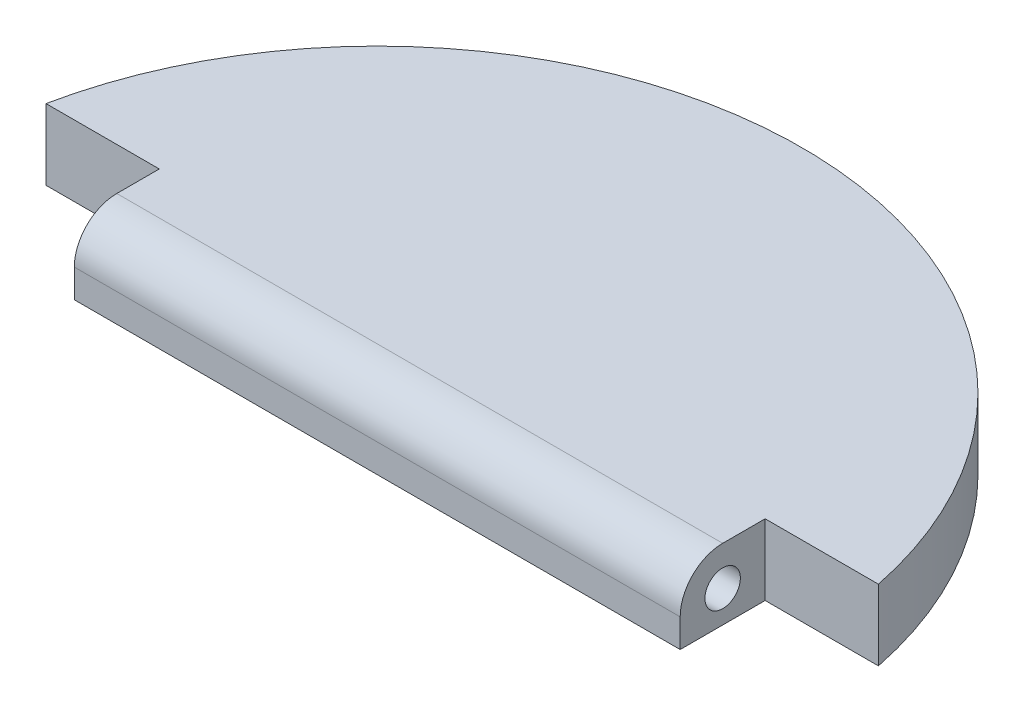
ISO-10303-21;
HEADER;
FILE_DESCRIPTION(('STEP AP214'),'2;1');
FILE_NAME('part.step','',(''),(''),'','','');
FILE_SCHEMA(('AUTOMOTIVE_DESIGN { 1 0 10303 214 1 1 1 1 }'));
ENDSEC;
DATA;
#1=APPLICATION_CONTEXT('core data for automotive mechanical design processes');
#2=APPLICATION_PROTOCOL_DEFINITION('international standard','automotive_design',2000,#1);
#3=PRODUCT_CONTEXT('',#1,'mechanical');
#4=PRODUCT('Part','Part','',(#3));
#5=PRODUCT_RELATED_PRODUCT_CATEGORY('part','',(#4));
#6=PRODUCT_DEFINITION_FORMATION('','',#4);
#7=PRODUCT_DEFINITION_CONTEXT('part definition',#1,'design');
#8=PRODUCT_DEFINITION('design','',#6,#7);
#9=PRODUCT_DEFINITION_SHAPE('','',#8);
#10=(LENGTH_UNIT() NAMED_UNIT(*) SI_UNIT(.MILLI.,.METRE.));
#11=(NAMED_UNIT(*) PLANE_ANGLE_UNIT() SI_UNIT($,.RADIAN.));
#12=(NAMED_UNIT(*) SI_UNIT($,.STERADIAN.) SOLID_ANGLE_UNIT());
#13=UNCERTAINTY_MEASURE_WITH_UNIT(LENGTH_MEASURE(1.E-05),#10,'distance_accuracy_value','');
#14=(GEOMETRIC_REPRESENTATION_CONTEXT(3) GLOBAL_UNCERTAINTY_ASSIGNED_CONTEXT((#13)) GLOBAL_UNIT_ASSIGNED_CONTEXT((#10,
#11,#12)) REPRESENTATION_CONTEXT('',''));
#15=CARTESIAN_POINT('',(0.,0.,0.));
#16=DIRECTION('',(0.,0.,1.));
#17=DIRECTION('',(1.,0.,0.));
#18=AXIS2_PLACEMENT_3D('',#15,#16,#17);
#19=CARTESIAN_POINT('',(0.,5.,0.));
#20=DIRECTION('',(0.,-1.,0.));
#21=DIRECTION('',(0.,0.,-1.));
#22=AXIS2_PLACEMENT_3D('',#19,#20,#21);
#23=CYLINDRICAL_SURFACE('',#22,30.);
#24=CARTESIAN_POINT('',(0.,0.,0.));
#25=DIRECTION('',(0.,1.,0.));
#26=DIRECTION('',(0.,0.,1.));
#27=AXIS2_PLACEMENT_3D('',#24,#25,#26);
#28=CIRCLE('',#27,30.);
#29=CARTESIAN_POINT('',(29.3938769133982,0.,-6.));
#30=VERTEX_POINT('',#29);
#31=CARTESIAN_POINT('',(-29.3938769133982,0.,-6.));
#32=VERTEX_POINT('',#31);
#33=EDGE_CURVE('E133',#30,#32,#28,.T.);
#34=ORIENTED_EDGE('',*,*,#33,.T.);
#35=DIRECTION('',(0.,1.,0.));
#36=VECTOR('',#35,1.);
#37=CARTESIAN_POINT('',(-29.3938769133982,-5.,-6.));
#38=LINE('',#37,#36);
#39=CARTESIAN_POINT('',(-29.3938769133982,5.,-6.));
#40=VERTEX_POINT('',#39);
#41=EDGE_CURVE('E118',#32,#40,#38,.T.);
#42=ORIENTED_EDGE('',*,*,#41,.T.);
#43=CARTESIAN_POINT('',(0.,5.,0.));
#44=DIRECTION('',(0.,1.,0.));
#45=DIRECTION('',(0.,0.,1.));
#46=AXIS2_PLACEMENT_3D('',#43,#44,#45);
#47=CIRCLE('',#46,30.);
#48=CARTESIAN_POINT('',(29.3938769133982,5.,-6.));
#49=VERTEX_POINT('',#48);
#50=EDGE_CURVE('E125',#49,#40,#47,.T.);
#51=ORIENTED_EDGE('',*,*,#50,.F.);
#52=DIRECTION('',(0.,1.,0.));
#53=VECTOR('',#52,1.);
#54=CARTESIAN_POINT('',(29.3938769133982,-5.,-6.));
#55=LINE('',#54,#53);
#56=EDGE_CURVE('E143',#30,#49,#55,.T.);
#57=ORIENTED_EDGE('',*,*,#56,.F.);
#58=EDGE_LOOP('',(#34,#42,#51,#57));
#59=FACE_BOUND('',#58,.T.);
#60=ADVANCED_FACE('F39',(#59),#23,.T.);
#61=CARTESIAN_POINT('',(-30.,5.,0.));
#62=DIRECTION('',(0.,0.,-1.));
#63=DIRECTION('',(-1.,0.,0.));
#64=AXIS2_PLACEMENT_3D('',#61,#62,#63);
#65=PLANE('',#64);
#66=DIRECTION('',(0.,1.,0.));
#67=VECTOR('',#66,1.);
#68=CARTESIAN_POINT('',(21.3938769133982,-5.,0.));
#69=LINE('',#68,#67);
#70=CARTESIAN_POINT('',(21.3938769133982,0.,0.));
#71=VERTEX_POINT('',#70);
#72=CARTESIAN_POINT('',(21.3938769133982,2.,0.));
#73=VERTEX_POINT('',#72);
#74=EDGE_CURVE('E109',#71,#73,#69,.T.);
#75=ORIENTED_EDGE('',*,*,#74,.T.);
#76=DIRECTION('',(1.,0.,0.));
#77=VECTOR('',#76,1.);
#78=CARTESIAN_POINT('',(-21.3938769133982,2.,0.));
#79=LINE('',#78,#77);
#80=CARTESIAN_POINT('',(-21.3938769133982,2.,0.));
#81=VERTEX_POINT('',#80);
#82=EDGE_CURVE('E48',#73,#81,#79,.F.);
#83=ORIENTED_EDGE('',*,*,#82,.T.);
#84=DIRECTION('',(0.,1.,0.));
#85=VECTOR('',#84,1.);
#86=CARTESIAN_POINT('',(-21.3938769133982,-5.,0.));
#87=LINE('',#86,#85);
#88=CARTESIAN_POINT('',(-21.3938769133982,0.,0.));
#89=VERTEX_POINT('',#88);
#90=EDGE_CURVE('E119',#89,#81,#87,.T.);
#91=ORIENTED_EDGE('',*,*,#90,.F.);
#92=DIRECTION('',(1.,0.,0.));
#93=VECTOR('',#92,1.);
#94=CARTESIAN_POINT('',(-30.,0.,0.));
#95=LINE('',#94,#93);
#96=EDGE_CURVE('E154',#89,#71,#95,.T.);
#97=ORIENTED_EDGE('',*,*,#96,.T.);
#98=EDGE_LOOP('',(#75,#83,#91,#97));
#99=FACE_BOUND('',#98,.T.);
#100=ADVANCED_FACE('F190',(#99),#65,.F.);
#101=CARTESIAN_POINT('',(0.,5.,0.));
#102=DIRECTION('',(0.,1.,0.));
#103=DIRECTION('',(0.,0.,1.));
#104=AXIS2_PLACEMENT_3D('',#101,#102,#103);
#105=PLANE('',#104);
#106=DIRECTION('',(0.,0.,-1.));
#107=VECTOR('',#106,1.);
#108=CARTESIAN_POINT('',(-21.3938769133982,5.,0.));
#109=LINE('',#108,#107);
#110=CARTESIAN_POINT('',(-21.3938769133982,5.,-3.));
#111=VERTEX_POINT('',#110);
#112=CARTESIAN_POINT('',(-21.3938769133982,5.,-6.));
#113=VERTEX_POINT('',#112);
#114=EDGE_CURVE('E97',#111,#113,#109,.T.);
#115=ORIENTED_EDGE('',*,*,#114,.F.);
#116=DIRECTION('',(1.,0.,0.));
#117=VECTOR('',#116,1.);
#118=CARTESIAN_POINT('',(21.3938769133982,5.,-3.));
#119=LINE('',#118,#117);
#120=CARTESIAN_POINT('',(21.3938769133982,5.,-3.));
#121=VERTEX_POINT('',#120);
#122=EDGE_CURVE('E173',#111,#121,#119,.T.);
#123=ORIENTED_EDGE('',*,*,#122,.T.);
#124=DIRECTION('',(0.,0.,1.));
#125=VECTOR('',#124,1.);
#126=CARTESIAN_POINT('',(21.3938769133982,5.,0.));
#127=LINE('',#126,#125);
#128=CARTESIAN_POINT('',(21.3938769133982,5.,-6.));
#129=VERTEX_POINT('',#128);
#130=EDGE_CURVE('E139',#129,#121,#127,.T.);
#131=ORIENTED_EDGE('',*,*,#130,.F.);
#132=DIRECTION('',(-1.,0.,0.));
#133=VECTOR('',#132,1.);
#134=CARTESIAN_POINT('',(21.3938769133982,5.,-6.));
#135=LINE('',#134,#133);
#136=EDGE_CURVE('E135',#49,#129,#135,.T.);
#137=ORIENTED_EDGE('',*,*,#136,.F.);
#138=ORIENTED_EDGE('',*,*,#50,.T.);
#139=DIRECTION('',(-1.,0.,0.));
#140=VECTOR('',#139,1.);
#141=CARTESIAN_POINT('',(-21.3938769133982,5.,-6.));
#142=LINE('',#141,#140);
#143=EDGE_CURVE('E108',#113,#40,#142,.T.);
#144=ORIENTED_EDGE('',*,*,#143,.F.);
#145=EDGE_LOOP('',(#115,#123,#131,#137,#138,#144));
#146=FACE_BOUND('',#145,.T.);
#147=ADVANCED_FACE('F122',(#146),#105,.T.);
#148=CARTESIAN_POINT('',(0.,0.,0.));
#149=DIRECTION('',(0.,1.,0.));
#150=DIRECTION('',(0.,0.,1.));
#151=AXIS2_PLACEMENT_3D('',#148,#149,#150);
#152=PLANE('',#151);
#153=DIRECTION('',(0.,0.,-1.));
#154=VECTOR('',#153,1.);
#155=CARTESIAN_POINT('',(-21.3938769133982,0.,0.));
#156=LINE('',#155,#154);
#157=CARTESIAN_POINT('',(-21.3938769133982,0.,-6.));
#158=VERTEX_POINT('',#157);
#159=EDGE_CURVE('E168',#89,#158,#156,.T.);
#160=ORIENTED_EDGE('',*,*,#159,.T.);
#161=DIRECTION('',(-1.,0.,0.));
#162=VECTOR('',#161,1.);
#163=CARTESIAN_POINT('',(0.,0.,-6.));
#164=LINE('',#163,#162);
#165=EDGE_CURVE('E115',#158,#32,#164,.T.);
#166=ORIENTED_EDGE('',*,*,#165,.T.);
#167=ORIENTED_EDGE('',*,*,#33,.F.);
#168=DIRECTION('',(-1.,0.,0.));
#169=VECTOR('',#168,1.);
#170=CARTESIAN_POINT('',(0.,0.,-6.));
#171=LINE('',#170,#169);
#172=CARTESIAN_POINT('',(21.3938769133982,0.,-6.));
#173=VERTEX_POINT('',#172);
#174=EDGE_CURVE('E153',#30,#173,#171,.T.);
#175=ORIENTED_EDGE('',*,*,#174,.T.);
#176=DIRECTION('',(0.,0.,1.));
#177=VECTOR('',#176,1.);
#178=CARTESIAN_POINT('',(21.3938769133982,0.,0.));
#179=LINE('',#178,#177);
#180=EDGE_CURVE('E164',#173,#71,#179,.T.);
#181=ORIENTED_EDGE('',*,*,#180,.T.);
#182=ORIENTED_EDGE('',*,*,#96,.F.);
#183=EDGE_LOOP('',(#160,#166,#167,#175,#181,#182));
#184=FACE_BOUND('',#183,.T.);
#185=ADVANCED_FACE('F188',(#184),#152,.F.);
#186=CARTESIAN_POINT('',(21.3938769133982,-5.,0.));
#187=DIRECTION('',(-1.,0.,0.));
#188=DIRECTION('',(0.,0.,1.));
#189=AXIS2_PLACEMENT_3D('',#186,#187,#188);
#190=PLANE('',#189);
#191=CARTESIAN_POINT('',(21.3938769133982,2.25,-3.));
#192=DIRECTION('',(1.,0.,0.));
#193=DIRECTION('',(0.,0.,-1.));
#194=AXIS2_PLACEMENT_3D('',#191,#192,#193);
#195=CIRCLE('',#194,1.25);
#196=CARTESIAN_POINT('',(21.3938769133982,2.25,-4.25));
#197=VERTEX_POINT('',#196);
#198=EDGE_CURVE('E235',#197,#197,#195,.T.);
#199=ORIENTED_EDGE('',*,*,#198,.F.);
#200=EDGE_LOOP('',(#199));
#201=FACE_BOUND('',#200,.T.);
#202=ORIENTED_EDGE('',*,*,#130,.T.);
#203=CARTESIAN_POINT('',(21.3938769133982,2.,-3.));
#204=DIRECTION('',(-1.,0.,0.));
#205=DIRECTION('',(0.,0.,1.));
#206=AXIS2_PLACEMENT_3D('',#203,#204,#205);
#207=CIRCLE('',#206,3.);
#208=EDGE_CURVE('E62',#121,#73,#207,.F.);
#209=ORIENTED_EDGE('',*,*,#208,.T.);
#210=ORIENTED_EDGE('',*,*,#74,.F.);
#211=ORIENTED_EDGE('',*,*,#180,.F.);
#212=DIRECTION('',(0.,1.,0.));
#213=VECTOR('',#212,1.);
#214=CARTESIAN_POINT('',(21.3938769133982,-5.,-6.));
#215=LINE('',#214,#213);
#216=EDGE_CURVE('E146',#173,#129,#215,.T.);
#217=ORIENTED_EDGE('',*,*,#216,.T.);
#218=EDGE_LOOP('',(#202,#209,#210,#211,#217));
#219=FACE_BOUND('',#218,.T.);
#220=ADVANCED_FACE('F180',(#201,#219),#190,.F.);
#221=CARTESIAN_POINT('',(21.3938769133982,-5.,-6.));
#222=DIRECTION('',(0.,0.,-1.));
#223=DIRECTION('',(-1.,0.,0.));
#224=AXIS2_PLACEMENT_3D('',#221,#222,#223);
#225=PLANE('',#224);
#226=ORIENTED_EDGE('',*,*,#56,.T.);
#227=ORIENTED_EDGE('',*,*,#136,.T.);
#228=ORIENTED_EDGE('',*,*,#216,.F.);
#229=ORIENTED_EDGE('',*,*,#174,.F.);
#230=EDGE_LOOP('',(#226,#227,#228,#229));
#231=FACE_BOUND('',#230,.T.);
#232=ADVANCED_FACE('F183',(#231),#225,.F.);
#233=CARTESIAN_POINT('',(-21.3938769133982,-5.,-6.));
#234=DIRECTION('',(0.,0.,-1.));
#235=DIRECTION('',(-1.,0.,0.));
#236=AXIS2_PLACEMENT_3D('',#233,#234,#235);
#237=PLANE('',#236);
#238=DIRECTION('',(0.,1.,0.));
#239=VECTOR('',#238,1.);
#240=CARTESIAN_POINT('',(-21.3938769133982,-5.,-6.));
#241=LINE('',#240,#239);
#242=EDGE_CURVE('E100',#158,#113,#241,.T.);
#243=ORIENTED_EDGE('',*,*,#242,.T.);
#244=ORIENTED_EDGE('',*,*,#143,.T.);
#245=ORIENTED_EDGE('',*,*,#41,.F.);
#246=ORIENTED_EDGE('',*,*,#165,.F.);
#247=EDGE_LOOP('',(#243,#244,#245,#246));
#248=FACE_BOUND('',#247,.T.);
#249=ADVANCED_FACE('F112',(#248),#237,.F.);
#250=CARTESIAN_POINT('',(-21.3938769133982,-5.,0.));
#251=DIRECTION('',(1.,0.,0.));
#252=DIRECTION('',(0.,0.,-1.));
#253=AXIS2_PLACEMENT_3D('',#250,#251,#252);
#254=PLANE('',#253);
#255=CARTESIAN_POINT('',(-21.3938769133982,2.25,-3.));
#256=DIRECTION('',(-1.,0.,0.));
#257=DIRECTION('',(0.,0.,1.));
#258=AXIS2_PLACEMENT_3D('',#255,#256,#257);
#259=CIRCLE('',#258,1.25);
#260=CARTESIAN_POINT('',(-21.3938769133982,2.25,-1.75));
#261=VERTEX_POINT('',#260);
#262=EDGE_CURVE('E236',#261,#261,#259,.T.);
#263=ORIENTED_EDGE('',*,*,#262,.F.);
#264=EDGE_LOOP('',(#263));
#265=FACE_BOUND('',#264,.T.);
#266=ORIENTED_EDGE('',*,*,#90,.T.);
#267=CARTESIAN_POINT('',(-21.3938769133982,2.,-3.));
#268=DIRECTION('',(1.,0.,0.));
#269=DIRECTION('',(0.,0.,-1.));
#270=AXIS2_PLACEMENT_3D('',#267,#268,#269);
#271=CIRCLE('',#270,3.);
#272=EDGE_CURVE('E11',#81,#111,#271,.F.);
#273=ORIENTED_EDGE('',*,*,#272,.T.);
#274=ORIENTED_EDGE('',*,*,#114,.T.);
#275=ORIENTED_EDGE('',*,*,#242,.F.);
#276=ORIENTED_EDGE('',*,*,#159,.F.);
#277=EDGE_LOOP('',(#266,#273,#274,#275,#276));
#278=FACE_BOUND('',#277,.T.);
#279=ADVANCED_FACE('F99',(#265,#278),#254,.F.);
#280=CARTESIAN_POINT('',(0.,2.,-3.));
#281=DIRECTION('',(-1.,0.,0.));
#282=DIRECTION('',(0.,0.,1.));
#283=AXIS2_PLACEMENT_3D('',#280,#281,#282);
#284=CYLINDRICAL_SURFACE('',#283,3.);
#285=ORIENTED_EDGE('',*,*,#272,.F.);
#286=ORIENTED_EDGE('',*,*,#82,.F.);
#287=ORIENTED_EDGE('',*,*,#208,.F.);
#288=ORIENTED_EDGE('',*,*,#122,.F.);
#289=EDGE_LOOP('',(#285,#286,#287,#288));
#290=FACE_BOUND('',#289,.T.);
#291=ADVANCED_FACE('F41',(#290),#284,.T.);
#292=CARTESIAN_POINT('',(18.3938769133982,2.25,-3.));
#293=DIRECTION('',(1.,0.,0.));
#294=DIRECTION('',(0.,0.,-1.));
#295=AXIS2_PLACEMENT_3D('',#292,#293,#294);
#296=CYLINDRICAL_SURFACE('',#295,1.25);
#297=CARTESIAN_POINT('',(18.3938769133982,2.25,-3.));
#298=DIRECTION('',(1.,0.,0.));
#299=DIRECTION('',(0.,0.,-1.));
#300=AXIS2_PLACEMENT_3D('',#297,#298,#299);
#301=CIRCLE('',#300,1.25);
#302=CARTESIAN_POINT('',(18.3938769133982,2.25,-4.25));
#303=VERTEX_POINT('',#302);
#304=EDGE_CURVE('E140',#303,#303,#301,.T.);
#305=ORIENTED_EDGE('',*,*,#304,.F.);
#306=EDGE_LOOP('',(#305));
#307=FACE_BOUND('',#306,.T.);
#308=ORIENTED_EDGE('',*,*,#198,.T.);
#309=EDGE_LOOP('',(#308));
#310=FACE_BOUND('',#309,.T.);
#311=ADVANCED_FACE('F192',(#307,#310),#296,.F.);
#312=CARTESIAN_POINT('',(18.3938769133982,2.25,-3.));
#313=DIRECTION('',(1.,0.,0.));
#314=DIRECTION('',(0.,0.,-1.));
#315=AXIS2_PLACEMENT_3D('',#312,#313,#314);
#316=PLANE('',#315);
#317=ORIENTED_EDGE('',*,*,#304,.T.);
#318=EDGE_LOOP('',(#317));
#319=FACE_BOUND('',#318,.T.);
#320=ADVANCED_FACE('F197',(#319),#316,.T.);
#321=CARTESIAN_POINT('',(-18.3938769133982,2.25,-3.));
#322=DIRECTION('',(-1.,0.,0.));
#323=DIRECTION('',(0.,0.,1.));
#324=AXIS2_PLACEMENT_3D('',#321,#322,#323);
#325=CYLINDRICAL_SURFACE('',#324,1.25);
#326=CARTESIAN_POINT('',(-18.3938769133982,2.25,-3.));
#327=DIRECTION('',(-1.,0.,0.));
#328=DIRECTION('',(0.,0.,1.));
#329=AXIS2_PLACEMENT_3D('',#326,#327,#328);
#330=CIRCLE('',#329,1.25);
#331=CARTESIAN_POINT('',(-18.3938769133982,2.25,-1.75));
#332=VERTEX_POINT('',#331);
#333=EDGE_CURVE('E233',#332,#332,#330,.T.);
#334=ORIENTED_EDGE('',*,*,#333,.F.);
#335=EDGE_LOOP('',(#334));
#336=FACE_BOUND('',#335,.T.);
#337=ORIENTED_EDGE('',*,*,#262,.T.);
#338=EDGE_LOOP('',(#337));
#339=FACE_BOUND('',#338,.T.);
#340=ADVANCED_FACE('F221',(#336,#339),#325,.F.);
#341=CARTESIAN_POINT('',(-18.3938769133982,2.25,-3.));
#342=DIRECTION('',(-1.,0.,0.));
#343=DIRECTION('',(0.,0.,1.));
#344=AXIS2_PLACEMENT_3D('',#341,#342,#343);
#345=PLANE('',#344);
#346=ORIENTED_EDGE('',*,*,#333,.T.);
#347=EDGE_LOOP('',(#346));
#348=FACE_BOUND('',#347,.T.);
#349=ADVANCED_FACE('F225',(#348),#345,.T.);
#350=CLOSED_SHELL('',(#60,#100,#147,#185,#220,#232,#249,#279,#291,#311,#320,#340,#349));
#351=MANIFOLD_SOLID_BREP('B2',#350);
#352=ADVANCED_BREP_SHAPE_REPRESENTATION('',(#18,#351),#14);
#353=SHAPE_DEFINITION_REPRESENTATION(#9,#352);
ENDSEC;
END-ISO-10303-21;
